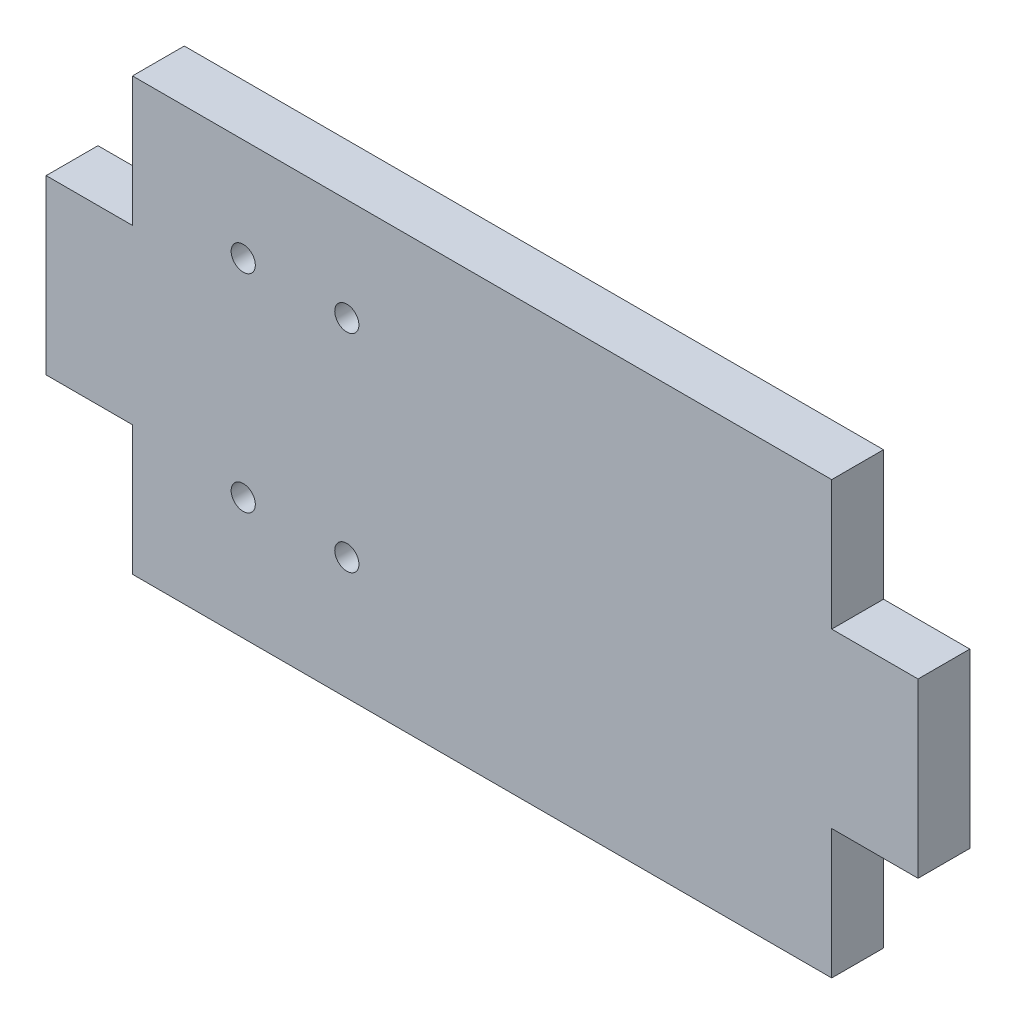
ISO-10303-21;
HEADER;
FILE_DESCRIPTION(('STEP AP214'),'2;1');
FILE_NAME('part.step','',(''),(''),'','','');
FILE_SCHEMA(('AUTOMOTIVE_DESIGN { 1 0 10303 214 1 1 1 1 }'));
ENDSEC;
DATA;
#1=APPLICATION_CONTEXT('core data for automotive mechanical design processes');
#2=APPLICATION_PROTOCOL_DEFINITION('international standard','automotive_design',2000,#1);
#3=PRODUCT_CONTEXT('',#1,'mechanical');
#4=PRODUCT('Part','Part','',(#3));
#5=PRODUCT_RELATED_PRODUCT_CATEGORY('part','',(#4));
#6=PRODUCT_DEFINITION_FORMATION('','',#4);
#7=PRODUCT_DEFINITION_CONTEXT('part definition',#1,'design');
#8=PRODUCT_DEFINITION('design','',#6,#7);
#9=PRODUCT_DEFINITION_SHAPE('','',#8);
#10=(LENGTH_UNIT() NAMED_UNIT(*) SI_UNIT(.MILLI.,.METRE.));
#11=(NAMED_UNIT(*) PLANE_ANGLE_UNIT() SI_UNIT($,.RADIAN.));
#12=(NAMED_UNIT(*) SI_UNIT($,.STERADIAN.) SOLID_ANGLE_UNIT());
#13=UNCERTAINTY_MEASURE_WITH_UNIT(LENGTH_MEASURE(1.E-05),#10,'distance_accuracy_value','');
#14=(GEOMETRIC_REPRESENTATION_CONTEXT(3) GLOBAL_UNCERTAINTY_ASSIGNED_CONTEXT((#13)) GLOBAL_UNIT_ASSIGNED_CONTEXT((#10,
#11,#12)) REPRESENTATION_CONTEXT('',''));
#15=CARTESIAN_POINT('',(0.,0.,0.));
#16=DIRECTION('',(0.,0.,1.));
#17=DIRECTION('',(1.,0.,0.));
#18=AXIS2_PLACEMENT_3D('',#15,#16,#17);
#19=CARTESIAN_POINT('',(12.8289276416906,14.12243627,9.95979797464431));
#20=DIRECTION('',(0.,0.,-1.));
#21=DIRECTION('',(-1.,0.,0.));
#22=AXIS2_PLACEMENT_3D('',#19,#20,#21);
#23=CYLINDRICAL_SURFACE('',#22,1.39999999999986);
#24=CARTESIAN_POINT('',(12.8289276416906,14.12243627,6.));
#25=DIRECTION('',(0.,0.,1.));
#26=DIRECTION('',(1.,0.,0.));
#27=AXIS2_PLACEMENT_3D('',#24,#25,#26);
#28=CIRCLE('',#27,1.39999999999986);
#29=CARTESIAN_POINT('',(14.2289276416904,14.12243627,6.));
#30=VERTEX_POINT('',#29);
#31=EDGE_CURVE('E167',#30,#30,#28,.F.);
#32=ORIENTED_EDGE('',*,*,#31,.F.);
#33=EDGE_LOOP('',(#32));
#34=FACE_BOUND('',#33,.T.);
#35=CARTESIAN_POINT('',(12.8289276416906,14.12243627,4.));
#36=DIRECTION('',(0.,0.,-1.));
#37=DIRECTION('',(-1.,0.,0.));
#38=AXIS2_PLACEMENT_3D('',#35,#36,#37);
#39=CIRCLE('',#38,1.39999999999986);
#40=CARTESIAN_POINT('',(11.4289276416907,14.12243627,4.));
#41=VERTEX_POINT('',#40);
#42=EDGE_CURVE('E41',#41,#41,#39,.F.);
#43=ORIENTED_EDGE('',*,*,#42,.F.);
#44=EDGE_LOOP('',(#43));
#45=FACE_BOUND('',#44,.T.);
#46=ADVANCED_FACE('F37',(#34,#45),#23,.F.);
#47=CARTESIAN_POINT('',(12.8289276416906,38.12243627,9.95979797464431));
#48=DIRECTION('',(0.,0.,-1.));
#49=DIRECTION('',(-1.,0.,0.));
#50=AXIS2_PLACEMENT_3D('',#47,#48,#49);
#51=CYLINDRICAL_SURFACE('',#50,1.39999999999987);
#52=CARTESIAN_POINT('',(12.8289276416906,38.12243627,6.));
#53=DIRECTION('',(0.,0.,1.));
#54=DIRECTION('',(1.,0.,0.));
#55=AXIS2_PLACEMENT_3D('',#52,#53,#54);
#56=CIRCLE('',#55,1.39999999999987);
#57=CARTESIAN_POINT('',(14.2289276416904,38.12243627,6.));
#58=VERTEX_POINT('',#57);
#59=EDGE_CURVE('E230',#58,#58,#56,.F.);
#60=ORIENTED_EDGE('',*,*,#59,.F.);
#61=EDGE_LOOP('',(#60));
#62=FACE_BOUND('',#61,.T.);
#63=CARTESIAN_POINT('',(12.8289276416906,38.12243627,4.));
#64=DIRECTION('',(0.,0.,-1.));
#65=DIRECTION('',(-1.,0.,0.));
#66=AXIS2_PLACEMENT_3D('',#63,#64,#65);
#67=CIRCLE('',#66,1.39999999999987);
#68=CARTESIAN_POINT('',(11.4289276416907,38.12243627,4.));
#69=VERTEX_POINT('',#68);
#70=EDGE_CURVE('E216',#69,#69,#67,.F.);
#71=ORIENTED_EDGE('',*,*,#70,.F.);
#72=EDGE_LOOP('',(#71));
#73=FACE_BOUND('',#72,.T.);
#74=ADVANCED_FACE('F272',(#62,#73),#51,.F.);
#75=CARTESIAN_POINT('',(24.8289276416906,38.12243627,9.95979797464431));
#76=DIRECTION('',(0.,0.,-1.));
#77=DIRECTION('',(-1.,0.,0.));
#78=AXIS2_PLACEMENT_3D('',#75,#76,#77);
#79=CYLINDRICAL_SURFACE('',#78,1.39999999999987);
#80=CARTESIAN_POINT('',(24.8289276416906,38.12243627,6.));
#81=DIRECTION('',(0.,0.,1.));
#82=DIRECTION('',(1.,0.,0.));
#83=AXIS2_PLACEMENT_3D('',#80,#81,#82);
#84=CIRCLE('',#83,1.39999999999987);
#85=CARTESIAN_POINT('',(26.2289276416904,38.12243627,6.));
#86=VERTEX_POINT('',#85);
#87=EDGE_CURVE('E225',#86,#86,#84,.F.);
#88=ORIENTED_EDGE('',*,*,#87,.F.);
#89=EDGE_LOOP('',(#88));
#90=FACE_BOUND('',#89,.T.);
#91=CARTESIAN_POINT('',(24.8289276416906,38.12243627,4.));
#92=DIRECTION('',(0.,0.,-1.));
#93=DIRECTION('',(-1.,0.,0.));
#94=AXIS2_PLACEMENT_3D('',#91,#92,#93);
#95=CIRCLE('',#94,1.39999999999987);
#96=CARTESIAN_POINT('',(23.4289276416907,38.12243627,4.));
#97=VERTEX_POINT('',#96);
#98=EDGE_CURVE('E213',#97,#97,#95,.F.);
#99=ORIENTED_EDGE('',*,*,#98,.F.);
#100=EDGE_LOOP('',(#99));
#101=FACE_BOUND('',#100,.T.);
#102=ADVANCED_FACE('F278',(#90,#101),#79,.F.);
#103=CARTESIAN_POINT('',(24.8289276416905,14.12243627,9.95979797464431));
#104=DIRECTION('',(0.,0.,-1.));
#105=DIRECTION('',(-1.,0.,0.));
#106=AXIS2_PLACEMENT_3D('',#103,#104,#105);
#107=CYLINDRICAL_SURFACE('',#106,1.39999999999987);
#108=CARTESIAN_POINT('',(24.8289276416905,14.12243627,6.));
#109=DIRECTION('',(0.,0.,1.));
#110=DIRECTION('',(1.,0.,0.));
#111=AXIS2_PLACEMENT_3D('',#108,#109,#110);
#112=CIRCLE('',#111,1.39999999999987);
#113=CARTESIAN_POINT('',(26.2289276416904,14.12243627,6.));
#114=VERTEX_POINT('',#113);
#115=EDGE_CURVE('E221',#114,#114,#112,.F.);
#116=ORIENTED_EDGE('',*,*,#115,.F.);
#117=EDGE_LOOP('',(#116));
#118=FACE_BOUND('',#117,.T.);
#119=CARTESIAN_POINT('',(24.8289276416905,14.12243627,4.));
#120=DIRECTION('',(0.,0.,-1.));
#121=DIRECTION('',(-1.,0.,0.));
#122=AXIS2_PLACEMENT_3D('',#119,#120,#121);
#123=CIRCLE('',#122,1.39999999999987);
#124=CARTESIAN_POINT('',(23.4289276416907,14.12243627,4.));
#125=VERTEX_POINT('',#124);
#126=EDGE_CURVE('E210',#125,#125,#123,.F.);
#127=ORIENTED_EDGE('',*,*,#126,.F.);
#128=EDGE_LOOP('',(#127));
#129=FACE_BOUND('',#128,.T.);
#130=ADVANCED_FACE('F284',(#118,#129),#107,.F.);
#131=CARTESIAN_POINT('',(0.,35.,6.));
#132=DIRECTION('',(0.,-1.,0.));
#133=DIRECTION('',(0.,0.,-1.));
#134=AXIS2_PLACEMENT_3D('',#131,#132,#133);
#135=PLANE('',#134);
#136=DIRECTION('',(-1.,0.,0.));
#137=VECTOR('',#136,1.);
#138=CARTESIAN_POINT('',(0.,35.,0.));
#139=LINE('',#138,#137);
#140=CARTESIAN_POINT('',(0.,35.,0.));
#141=VERTEX_POINT('',#140);
#142=CARTESIAN_POINT('',(-10.,35.,0.));
#143=VERTEX_POINT('',#142);
#144=EDGE_CURVE('E164',#141,#143,#139,.T.);
#145=ORIENTED_EDGE('',*,*,#144,.T.);
#146=DIRECTION('',(0.,0.,-1.));
#147=VECTOR('',#146,1.);
#148=CARTESIAN_POINT('',(-10.,35.,6.));
#149=LINE('',#148,#147);
#150=CARTESIAN_POINT('',(-10.,35.,6.));
#151=VERTEX_POINT('',#150);
#152=EDGE_CURVE('E11',#151,#143,#149,.T.);
#153=ORIENTED_EDGE('',*,*,#152,.F.);
#154=DIRECTION('',(-1.,0.,0.));
#155=VECTOR('',#154,1.);
#156=CARTESIAN_POINT('',(0.,35.,6.));
#157=LINE('',#156,#155);
#158=CARTESIAN_POINT('',(0.,35.,6.));
#159=VERTEX_POINT('',#158);
#160=EDGE_CURVE('E236',#159,#151,#157,.T.);
#161=ORIENTED_EDGE('',*,*,#160,.F.);
#162=DIRECTION('',(0.,0.,-1.));
#163=VECTOR('',#162,1.);
#164=CARTESIAN_POINT('',(0.,35.,6.));
#165=LINE('',#164,#163);
#166=EDGE_CURVE('E56',#159,#141,#165,.T.);
#167=ORIENTED_EDGE('',*,*,#166,.T.);
#168=EDGE_LOOP('',(#145,#153,#161,#167));
#169=FACE_BOUND('',#168,.T.);
#170=ADVANCED_FACE('F39',(#169),#135,.F.);
#171=CARTESIAN_POINT('',(-10.,0.,6.));
#172=DIRECTION('',(1.,0.,0.));
#173=DIRECTION('',(0.,1.,0.));
#174=AXIS2_PLACEMENT_3D('',#171,#172,#173);
#175=PLANE('',#174);
#176=DIRECTION('',(0.,-1.,0.));
#177=VECTOR('',#176,1.);
#178=CARTESIAN_POINT('',(-10.,0.,0.));
#179=LINE('',#178,#177);
#180=CARTESIAN_POINT('',(-10.,15.,0.));
#181=VERTEX_POINT('',#180);
#182=EDGE_CURVE('E166',#143,#181,#179,.T.);
#183=ORIENTED_EDGE('',*,*,#182,.T.);
#184=DIRECTION('',(0.,0.,-1.));
#185=VECTOR('',#184,1.);
#186=CARTESIAN_POINT('',(-10.,15.,6.));
#187=LINE('',#186,#185);
#188=CARTESIAN_POINT('',(-10.,15.,6.));
#189=VERTEX_POINT('',#188);
#190=EDGE_CURVE('E47',#189,#181,#187,.T.);
#191=ORIENTED_EDGE('',*,*,#190,.F.);
#192=DIRECTION('',(0.,-1.,0.));
#193=VECTOR('',#192,1.);
#194=CARTESIAN_POINT('',(-10.,0.,6.));
#195=LINE('',#194,#193);
#196=EDGE_CURVE('E106',#151,#189,#195,.T.);
#197=ORIENTED_EDGE('',*,*,#196,.F.);
#198=ORIENTED_EDGE('',*,*,#152,.T.);
#199=EDGE_LOOP('',(#183,#191,#197,#198));
#200=FACE_BOUND('',#199,.T.);
#201=ADVANCED_FACE('F376',(#200),#175,.F.);
#202=CARTESIAN_POINT('',(0.,15.,6.));
#203=DIRECTION('',(0.,-1.,0.));
#204=DIRECTION('',(0.,0.,-1.));
#205=AXIS2_PLACEMENT_3D('',#202,#203,#204);
#206=PLANE('',#205);
#207=DIRECTION('',(-1.,0.,0.));
#208=VECTOR('',#207,1.);
#209=CARTESIAN_POINT('',(0.,15.,0.));
#210=LINE('',#209,#208);
#211=CARTESIAN_POINT('',(0.,15.,0.));
#212=VERTEX_POINT('',#211);
#213=EDGE_CURVE('E170',#212,#181,#210,.T.);
#214=ORIENTED_EDGE('',*,*,#213,.F.);
#215=DIRECTION('',(0.,0.,-1.));
#216=VECTOR('',#215,1.);
#217=CARTESIAN_POINT('',(0.,15.,6.));
#218=LINE('',#217,#216);
#219=CARTESIAN_POINT('',(0.,15.,6.));
#220=VERTEX_POINT('',#219);
#221=EDGE_CURVE('E207',#220,#212,#218,.T.);
#222=ORIENTED_EDGE('',*,*,#221,.F.);
#223=DIRECTION('',(-1.,0.,0.));
#224=VECTOR('',#223,1.);
#225=CARTESIAN_POINT('',(0.,15.,6.));
#226=LINE('',#225,#224);
#227=EDGE_CURVE('E239',#220,#189,#226,.T.);
#228=ORIENTED_EDGE('',*,*,#227,.T.);
#229=ORIENTED_EDGE('',*,*,#190,.T.);
#230=EDGE_LOOP('',(#214,#222,#228,#229));
#231=FACE_BOUND('',#230,.T.);
#232=ADVANCED_FACE('F269',(#231),#206,.T.);
#233=CARTESIAN_POINT('',(0.,0.,6.));
#234=DIRECTION('',(-1.,0.,0.));
#235=DIRECTION('',(0.,0.,1.));
#236=AXIS2_PLACEMENT_3D('',#233,#234,#235);
#237=PLANE('',#236);
#238=DIRECTION('',(0.,1.,0.));
#239=VECTOR('',#238,1.);
#240=CARTESIAN_POINT('',(0.,0.,0.));
#241=LINE('',#240,#239);
#242=CARTESIAN_POINT('',(0.,0.,0.));
#243=VERTEX_POINT('',#242);
#244=EDGE_CURVE('E173',#243,#212,#241,.T.);
#245=ORIENTED_EDGE('',*,*,#244,.F.);
#246=DIRECTION('',(0.,0.,-1.));
#247=VECTOR('',#246,1.);
#248=CARTESIAN_POINT('',(0.,0.,6.));
#249=LINE('',#248,#247);
#250=CARTESIAN_POINT('',(0.,0.,6.));
#251=VERTEX_POINT('',#250);
#252=EDGE_CURVE('E205',#251,#243,#249,.T.);
#253=ORIENTED_EDGE('',*,*,#252,.F.);
#254=DIRECTION('',(0.,1.,0.));
#255=VECTOR('',#254,1.);
#256=CARTESIAN_POINT('',(0.,0.,6.));
#257=LINE('',#256,#255);
#258=EDGE_CURVE('E160',#251,#220,#257,.T.);
#259=ORIENTED_EDGE('',*,*,#258,.T.);
#260=ORIENTED_EDGE('',*,*,#221,.T.);
#261=EDGE_LOOP('',(#245,#253,#259,#260));
#262=FACE_BOUND('',#261,.T.);
#263=ADVANCED_FACE('F259',(#262),#237,.T.);
#264=CARTESIAN_POINT('',(0.,0.,6.));
#265=DIRECTION('',(0.,1.,0.));
#266=DIRECTION('',(0.,0.,1.));
#267=AXIS2_PLACEMENT_3D('',#264,#265,#266);
#268=PLANE('',#267);
#269=DIRECTION('',(1.,0.,0.));
#270=VECTOR('',#269,1.);
#271=CARTESIAN_POINT('',(0.,0.,0.));
#272=LINE('',#271,#270);
#273=CARTESIAN_POINT('',(81.,0.,0.));
#274=VERTEX_POINT('',#273);
#275=EDGE_CURVE('E176',#243,#274,#272,.T.);
#276=ORIENTED_EDGE('',*,*,#275,.T.);
#277=DIRECTION('',(0.,0.,-1.));
#278=VECTOR('',#277,1.);
#279=CARTESIAN_POINT('',(81.,0.,6.));
#280=LINE('',#279,#278);
#281=CARTESIAN_POINT('',(81.,0.,6.));
#282=VERTEX_POINT('',#281);
#283=EDGE_CURVE('E202',#282,#274,#280,.T.);
#284=ORIENTED_EDGE('',*,*,#283,.F.);
#285=DIRECTION('',(1.,0.,0.));
#286=VECTOR('',#285,1.);
#287=CARTESIAN_POINT('',(0.,0.,6.));
#288=LINE('',#287,#286);
#289=EDGE_CURVE('E243',#251,#282,#288,.T.);
#290=ORIENTED_EDGE('',*,*,#289,.F.);
#291=ORIENTED_EDGE('',*,*,#252,.T.);
#292=EDGE_LOOP('',(#276,#284,#290,#291));
#293=FACE_BOUND('',#292,.T.);
#294=ADVANCED_FACE('F268',(#293),#268,.F.);
#295=CARTESIAN_POINT('',(81.,0.,6.));
#296=DIRECTION('',(-1.,0.,0.));
#297=DIRECTION('',(0.,0.,1.));
#298=AXIS2_PLACEMENT_3D('',#295,#296,#297);
#299=PLANE('',#298);
#300=DIRECTION('',(0.,1.,0.));
#301=VECTOR('',#300,1.);
#302=CARTESIAN_POINT('',(81.,0.,0.));
#303=LINE('',#302,#301);
#304=CARTESIAN_POINT('',(81.,15.,0.));
#305=VERTEX_POINT('',#304);
#306=EDGE_CURVE('E179',#274,#305,#303,.T.);
#307=ORIENTED_EDGE('',*,*,#306,.T.);
#308=DIRECTION('',(0.,0.,-1.));
#309=VECTOR('',#308,1.);
#310=CARTESIAN_POINT('',(81.,15.,6.));
#311=LINE('',#310,#309);
#312=CARTESIAN_POINT('',(81.,15.,6.));
#313=VERTEX_POINT('',#312);
#314=EDGE_CURVE('E199',#313,#305,#311,.T.);
#315=ORIENTED_EDGE('',*,*,#314,.F.);
#316=DIRECTION('',(0.,1.,0.));
#317=VECTOR('',#316,1.);
#318=CARTESIAN_POINT('',(81.,0.,6.));
#319=LINE('',#318,#317);
#320=EDGE_CURVE('E146',#282,#313,#319,.T.);
#321=ORIENTED_EDGE('',*,*,#320,.F.);
#322=ORIENTED_EDGE('',*,*,#283,.T.);
#323=EDGE_LOOP('',(#307,#315,#321,#322));
#324=FACE_BOUND('',#323,.T.);
#325=ADVANCED_FACE('F398',(#324),#299,.F.);
#326=CARTESIAN_POINT('',(0.,15.,6.));
#327=DIRECTION('',(0.,1.,0.));
#328=DIRECTION('',(0.,0.,1.));
#329=AXIS2_PLACEMENT_3D('',#326,#327,#328);
#330=PLANE('',#329);
#331=DIRECTION('',(1.,0.,0.));
#332=VECTOR('',#331,1.);
#333=CARTESIAN_POINT('',(0.,15.,0.));
#334=LINE('',#333,#332);
#335=CARTESIAN_POINT('',(91.,15.,0.));
#336=VERTEX_POINT('',#335);
#337=EDGE_CURVE('E181',#305,#336,#334,.T.);
#338=ORIENTED_EDGE('',*,*,#337,.T.);
#339=DIRECTION('',(0.,0.,-1.));
#340=VECTOR('',#339,1.);
#341=CARTESIAN_POINT('',(91.,15.,6.));
#342=LINE('',#341,#340);
#343=CARTESIAN_POINT('',(91.,15.,6.));
#344=VERTEX_POINT('',#343);
#345=EDGE_CURVE('E197',#344,#336,#342,.T.);
#346=ORIENTED_EDGE('',*,*,#345,.F.);
#347=DIRECTION('',(1.,0.,0.));
#348=VECTOR('',#347,1.);
#349=CARTESIAN_POINT('',(0.,15.,6.));
#350=LINE('',#349,#348);
#351=EDGE_CURVE('E245',#313,#344,#350,.T.);
#352=ORIENTED_EDGE('',*,*,#351,.F.);
#353=ORIENTED_EDGE('',*,*,#314,.T.);
#354=EDGE_LOOP('',(#338,#346,#352,#353));
#355=FACE_BOUND('',#354,.T.);
#356=ADVANCED_FACE('F402',(#355),#330,.F.);
#357=CARTESIAN_POINT('',(91.,0.,6.));
#358=DIRECTION('',(1.,0.,0.));
#359=DIRECTION('',(0.,0.,-1.));
#360=AXIS2_PLACEMENT_3D('',#357,#358,#359);
#361=PLANE('',#360);
#362=DIRECTION('',(0.,-1.,0.));
#363=VECTOR('',#362,1.);
#364=CARTESIAN_POINT('',(91.,0.,0.));
#365=LINE('',#364,#363);
#366=CARTESIAN_POINT('',(91.,35.,0.));
#367=VERTEX_POINT('',#366);
#368=EDGE_CURVE('E184',#367,#336,#365,.T.);
#369=ORIENTED_EDGE('',*,*,#368,.F.);
#370=DIRECTION('',(0.,0.,-1.));
#371=VECTOR('',#370,1.);
#372=CARTESIAN_POINT('',(91.,35.,6.));
#373=LINE('',#372,#371);
#374=CARTESIAN_POINT('',(91.,35.,6.));
#375=VERTEX_POINT('',#374);
#376=EDGE_CURVE('E195',#375,#367,#373,.T.);
#377=ORIENTED_EDGE('',*,*,#376,.F.);
#378=DIRECTION('',(0.,-1.,0.));
#379=VECTOR('',#378,1.);
#380=CARTESIAN_POINT('',(91.,0.,6.));
#381=LINE('',#380,#379);
#382=EDGE_CURVE('E246',#375,#344,#381,.T.);
#383=ORIENTED_EDGE('',*,*,#382,.T.);
#384=ORIENTED_EDGE('',*,*,#345,.T.);
#385=EDGE_LOOP('',(#369,#377,#383,#384));
#386=FACE_BOUND('',#385,.T.);
#387=ADVANCED_FACE('F403',(#386),#361,.T.);
#388=CARTESIAN_POINT('',(0.,35.,6.));
#389=DIRECTION('',(0.,1.,0.));
#390=DIRECTION('',(0.,0.,1.));
#391=AXIS2_PLACEMENT_3D('',#388,#389,#390);
#392=PLANE('',#391);
#393=DIRECTION('',(1.,0.,0.));
#394=VECTOR('',#393,1.);
#395=CARTESIAN_POINT('',(0.,35.,0.));
#396=LINE('',#395,#394);
#397=CARTESIAN_POINT('',(81.,35.,0.));
#398=VERTEX_POINT('',#397);
#399=EDGE_CURVE('E187',#398,#367,#396,.T.);
#400=ORIENTED_EDGE('',*,*,#399,.F.);
#401=DIRECTION('',(0.,0.,-1.));
#402=VECTOR('',#401,1.);
#403=CARTESIAN_POINT('',(81.,35.,6.));
#404=LINE('',#403,#402);
#405=CARTESIAN_POINT('',(81.,35.,6.));
#406=VERTEX_POINT('',#405);
#407=EDGE_CURVE('E154',#406,#398,#404,.T.);
#408=ORIENTED_EDGE('',*,*,#407,.F.);
#409=DIRECTION('',(1.,0.,0.));
#410=VECTOR('',#409,1.);
#411=CARTESIAN_POINT('',(0.,35.,6.));
#412=LINE('',#411,#410);
#413=EDGE_CURVE('E143',#406,#375,#412,.T.);
#414=ORIENTED_EDGE('',*,*,#413,.T.);
#415=ORIENTED_EDGE('',*,*,#376,.T.);
#416=EDGE_LOOP('',(#400,#408,#414,#415));
#417=FACE_BOUND('',#416,.T.);
#418=ADVANCED_FACE('F251',(#417),#392,.T.);
#419=CARTESIAN_POINT('',(81.,50.,0.));
#420=VERTEX_POINT('',#419);
#421=EDGE_CURVE('E151',#398,#420,#303,.T.);
#422=ORIENTED_EDGE('',*,*,#421,.T.);
#423=DIRECTION('',(0.,0.,-1.));
#424=VECTOR('',#423,1.);
#425=CARTESIAN_POINT('',(81.,50.,6.));
#426=LINE('',#425,#424);
#427=CARTESIAN_POINT('',(81.,50.,6.));
#428=VERTEX_POINT('',#427);
#429=EDGE_CURVE('E148',#428,#420,#426,.T.);
#430=ORIENTED_EDGE('',*,*,#429,.F.);
#431=EDGE_CURVE('E135',#406,#428,#319,.T.);
#432=ORIENTED_EDGE('',*,*,#431,.F.);
#433=ORIENTED_EDGE('',*,*,#407,.T.);
#434=EDGE_LOOP('',(#422,#430,#432,#433));
#435=FACE_BOUND('',#434,.T.);
#436=ADVANCED_FACE('F149',(#435),#299,.F.);
#437=CARTESIAN_POINT('',(0.,50.,6.));
#438=DIRECTION('',(0.,1.,0.));
#439=DIRECTION('',(0.,0.,1.));
#440=AXIS2_PLACEMENT_3D('',#437,#438,#439);
#441=PLANE('',#440);
#442=DIRECTION('',(1.,0.,0.));
#443=VECTOR('',#442,1.);
#444=CARTESIAN_POINT('',(0.,50.,0.));
#445=LINE('',#444,#443);
#446=CARTESIAN_POINT('',(0.,50.,0.));
#447=VERTEX_POINT('',#446);
#448=EDGE_CURVE('E190',#447,#420,#445,.T.);
#449=ORIENTED_EDGE('',*,*,#448,.F.);
#450=DIRECTION('',(0.,0.,-1.));
#451=VECTOR('',#450,1.);
#452=CARTESIAN_POINT('',(0.,50.,6.));
#453=LINE('',#452,#451);
#454=CARTESIAN_POINT('',(0.,50.,6.));
#455=VERTEX_POINT('',#454);
#456=EDGE_CURVE('E94',#455,#447,#453,.T.);
#457=ORIENTED_EDGE('',*,*,#456,.F.);
#458=DIRECTION('',(1.,0.,0.));
#459=VECTOR('',#458,1.);
#460=CARTESIAN_POINT('',(0.,50.,6.));
#461=LINE('',#460,#459);
#462=EDGE_CURVE('E140',#455,#428,#461,.T.);
#463=ORIENTED_EDGE('',*,*,#462,.T.);
#464=ORIENTED_EDGE('',*,*,#429,.T.);
#465=EDGE_LOOP('',(#449,#457,#463,#464));
#466=FACE_BOUND('',#465,.T.);
#467=ADVANCED_FACE('F156',(#466),#441,.T.);
#468=EDGE_CURVE('E177',#141,#447,#241,.T.);
#469=ORIENTED_EDGE('',*,*,#468,.F.);
#470=ORIENTED_EDGE('',*,*,#166,.F.);
#471=EDGE_CURVE('E157',#159,#455,#257,.T.);
#472=ORIENTED_EDGE('',*,*,#471,.T.);
#473=ORIENTED_EDGE('',*,*,#456,.T.);
#474=EDGE_LOOP('',(#469,#470,#472,#473));
#475=FACE_BOUND('',#474,.T.);
#476=ADVANCED_FACE('F256',(#475),#237,.T.);
#477=CARTESIAN_POINT('',(0.,0.,6.));
#478=DIRECTION('',(0.,0.,1.));
#479=DIRECTION('',(1.,0.,0.));
#480=AXIS2_PLACEMENT_3D('',#477,#478,#479);
#481=PLANE('',#480);
#482=ORIENTED_EDGE('',*,*,#115,.T.);
#483=EDGE_LOOP('',(#482));
#484=FACE_BOUND('',#483,.T.);
#485=ORIENTED_EDGE('',*,*,#87,.T.);
#486=EDGE_LOOP('',(#485));
#487=FACE_BOUND('',#486,.T.);
#488=ORIENTED_EDGE('',*,*,#59,.T.);
#489=EDGE_LOOP('',(#488));
#490=FACE_BOUND('',#489,.T.);
#491=ORIENTED_EDGE('',*,*,#31,.T.);
#492=EDGE_LOOP('',(#491));
#493=FACE_BOUND('',#492,.T.);
#494=ORIENTED_EDGE('',*,*,#160,.T.);
#495=ORIENTED_EDGE('',*,*,#196,.T.);
#496=ORIENTED_EDGE('',*,*,#227,.F.);
#497=ORIENTED_EDGE('',*,*,#258,.F.);
#498=ORIENTED_EDGE('',*,*,#289,.T.);
#499=ORIENTED_EDGE('',*,*,#320,.T.);
#500=ORIENTED_EDGE('',*,*,#351,.T.);
#501=ORIENTED_EDGE('',*,*,#382,.F.);
#502=ORIENTED_EDGE('',*,*,#413,.F.);
#503=ORIENTED_EDGE('',*,*,#431,.T.);
#504=ORIENTED_EDGE('',*,*,#462,.F.);
#505=ORIENTED_EDGE('',*,*,#471,.F.);
#506=EDGE_LOOP('',(#494,#495,#496,#497,#498,#499,#500,#501,#502,#503,#504,#505));
#507=FACE_BOUND('',#506,.T.);
#508=ADVANCED_FACE('F137',(#484,#487,#490,#493,#507),#481,.T.);
#509=CARTESIAN_POINT('',(0.,0.,0.));
#510=DIRECTION('',(0.,0.,1.));
#511=DIRECTION('',(1.,0.,0.));
#512=AXIS2_PLACEMENT_3D('',#509,#510,#511);
#513=PLANE('',#512);
#514=CARTESIAN_POINT('',(24.8289276416905,14.12243627,0.));
#515=DIRECTION('',(0.,0.,-1.));
#516=DIRECTION('',(-1.,0.,0.));
#517=AXIS2_PLACEMENT_3D('',#514,#515,#516);
#518=CIRCLE('',#517,2.99999999999988);
#519=CARTESIAN_POINT('',(21.8289276416907,14.12243627,0.));
#520=VERTEX_POINT('',#519);
#521=EDGE_CURVE('E298',#520,#520,#518,.T.);
#522=ORIENTED_EDGE('',*,*,#521,.F.);
#523=EDGE_LOOP('',(#522));
#524=FACE_BOUND('',#523,.T.);
#525=CARTESIAN_POINT('',(12.8289276416906,14.12243627,0.));
#526=DIRECTION('',(0.,0.,-1.));
#527=DIRECTION('',(-1.,0.,0.));
#528=AXIS2_PLACEMENT_3D('',#525,#526,#527);
#529=CIRCLE('',#528,2.99999999999987);
#530=CARTESIAN_POINT('',(9.82892764169068,14.12243627,0.));
#531=VERTEX_POINT('',#530);
#532=EDGE_CURVE('E302',#531,#531,#529,.T.);
#533=ORIENTED_EDGE('',*,*,#532,.F.);
#534=EDGE_LOOP('',(#533));
#535=FACE_BOUND('',#534,.T.);
#536=CARTESIAN_POINT('',(12.8289276416906,38.12243627,0.));
#537=DIRECTION('',(0.,0.,-1.));
#538=DIRECTION('',(-1.,0.,0.));
#539=AXIS2_PLACEMENT_3D('',#536,#537,#538);
#540=CIRCLE('',#539,2.99999999999987);
#541=CARTESIAN_POINT('',(9.82892764169068,38.12243627,0.));
#542=VERTEX_POINT('',#541);
#543=EDGE_CURVE('E306',#542,#542,#540,.T.);
#544=ORIENTED_EDGE('',*,*,#543,.F.);
#545=EDGE_LOOP('',(#544));
#546=FACE_BOUND('',#545,.T.);
#547=CARTESIAN_POINT('',(24.8289276416906,38.12243627,0.));
#548=DIRECTION('',(0.,0.,-1.));
#549=DIRECTION('',(-1.,0.,0.));
#550=AXIS2_PLACEMENT_3D('',#547,#548,#549);
#551=CIRCLE('',#550,2.99999999999988);
#552=CARTESIAN_POINT('',(21.8289276416907,38.12243627,0.));
#553=VERTEX_POINT('',#552);
#554=EDGE_CURVE('E309',#553,#553,#551,.T.);
#555=ORIENTED_EDGE('',*,*,#554,.F.);
#556=EDGE_LOOP('',(#555));
#557=FACE_BOUND('',#556,.T.);
#558=ORIENTED_EDGE('',*,*,#144,.F.);
#559=ORIENTED_EDGE('',*,*,#468,.T.);
#560=ORIENTED_EDGE('',*,*,#448,.T.);
#561=ORIENTED_EDGE('',*,*,#421,.F.);
#562=ORIENTED_EDGE('',*,*,#399,.T.);
#563=ORIENTED_EDGE('',*,*,#368,.T.);
#564=ORIENTED_EDGE('',*,*,#337,.F.);
#565=ORIENTED_EDGE('',*,*,#306,.F.);
#566=ORIENTED_EDGE('',*,*,#275,.F.);
#567=ORIENTED_EDGE('',*,*,#244,.T.);
#568=ORIENTED_EDGE('',*,*,#213,.T.);
#569=ORIENTED_EDGE('',*,*,#182,.F.);
#570=EDGE_LOOP('',(#558,#559,#560,#561,#562,#563,#564,#565,#566,#567,#568,#569));
#571=FACE_BOUND('',#570,.T.);
#572=ADVANCED_FACE('F254',(#524,#535,#546,#557,#571),#513,.F.);
#573=CARTESIAN_POINT('',(24.8289276416905,14.12243627,4.));
#574=DIRECTION('',(0.,0.,-1.));
#575=DIRECTION('',(-1.,0.,0.));
#576=AXIS2_PLACEMENT_3D('',#573,#574,#575);
#577=PLANE('',#576);
#578=CARTESIAN_POINT('',(24.8289276416905,14.12243627,4.));
#579=DIRECTION('',(0.,0.,-1.));
#580=DIRECTION('',(-1.,0.,0.));
#581=AXIS2_PLACEMENT_3D('',#578,#579,#580);
#582=CIRCLE('',#581,2.99999999999988);
#583=CARTESIAN_POINT('',(21.8289276416907,14.12243627,4.));
#584=VERTEX_POINT('',#583);
#585=EDGE_CURVE('E324',#584,#584,#582,.T.);
#586=ORIENTED_EDGE('',*,*,#585,.T.);
#587=EDGE_LOOP('',(#586));
#588=FACE_BOUND('',#587,.T.);
#589=ORIENTED_EDGE('',*,*,#126,.T.);
#590=EDGE_LOOP('',(#589));
#591=FACE_BOUND('',#590,.T.);
#592=ADVANCED_FACE('F287',(#588,#591),#577,.T.);
#593=CARTESIAN_POINT('',(24.8289276416905,14.12243627,4.));
#594=DIRECTION('',(0.,0.,-1.));
#595=DIRECTION('',(-1.,0.,0.));
#596=AXIS2_PLACEMENT_3D('',#593,#594,#595);
#597=CYLINDRICAL_SURFACE('',#596,2.99999999999988);
#598=ORIENTED_EDGE('',*,*,#585,.F.);
#599=EDGE_LOOP('',(#598));
#600=FACE_BOUND('',#599,.T.);
#601=ORIENTED_EDGE('',*,*,#521,.T.);
#602=EDGE_LOOP('',(#601));
#603=FACE_BOUND('',#602,.T.);
#604=ADVANCED_FACE('F292',(#600,#603),#597,.F.);
#605=CARTESIAN_POINT('',(24.8289276416906,38.12243627,4.));
#606=DIRECTION('',(0.,0.,-1.));
#607=DIRECTION('',(-1.,0.,0.));
#608=AXIS2_PLACEMENT_3D('',#605,#606,#607);
#609=PLANE('',#608);
#610=CARTESIAN_POINT('',(24.8289276416906,38.12243627,4.));
#611=DIRECTION('',(0.,0.,-1.));
#612=DIRECTION('',(-1.,0.,0.));
#613=AXIS2_PLACEMENT_3D('',#610,#611,#612);
#614=CIRCLE('',#613,2.99999999999988);
#615=CARTESIAN_POINT('',(21.8289276416907,38.12243627,4.));
#616=VERTEX_POINT('',#615);
#617=EDGE_CURVE('E214',#616,#616,#614,.T.);
#618=ORIENTED_EDGE('',*,*,#617,.T.);
#619=EDGE_LOOP('',(#618));
#620=FACE_BOUND('',#619,.T.);
#621=ORIENTED_EDGE('',*,*,#98,.T.);
#622=EDGE_LOOP('',(#621));
#623=FACE_BOUND('',#622,.T.);
#624=ADVANCED_FACE('F355',(#620,#623),#609,.T.);
#625=CARTESIAN_POINT('',(24.8289276416906,38.12243627,4.));
#626=DIRECTION('',(0.,0.,-1.));
#627=DIRECTION('',(-1.,0.,0.));
#628=AXIS2_PLACEMENT_3D('',#625,#626,#627);
#629=CYLINDRICAL_SURFACE('',#628,2.99999999999988);
#630=ORIENTED_EDGE('',*,*,#617,.F.);
#631=EDGE_LOOP('',(#630));
#632=FACE_BOUND('',#631,.T.);
#633=ORIENTED_EDGE('',*,*,#554,.T.);
#634=EDGE_LOOP('',(#633));
#635=FACE_BOUND('',#634,.T.);
#636=ADVANCED_FACE('F345',(#632,#635),#629,.F.);
#637=CARTESIAN_POINT('',(12.8289276416906,38.12243627,4.));
#638=DIRECTION('',(0.,0.,-1.));
#639=DIRECTION('',(-1.,0.,0.));
#640=AXIS2_PLACEMENT_3D('',#637,#638,#639);
#641=PLANE('',#640);
#642=CARTESIAN_POINT('',(12.8289276416906,38.12243627,4.));
#643=DIRECTION('',(0.,0.,-1.));
#644=DIRECTION('',(-1.,0.,0.));
#645=AXIS2_PLACEMENT_3D('',#642,#643,#644);
#646=CIRCLE('',#645,2.99999999999987);
#647=CARTESIAN_POINT('',(9.82892764169068,38.12243627,4.));
#648=VERTEX_POINT('',#647);
#649=EDGE_CURVE('E311',#648,#648,#646,.T.);
#650=ORIENTED_EDGE('',*,*,#649,.T.);
#651=EDGE_LOOP('',(#650));
#652=FACE_BOUND('',#651,.T.);
#653=ORIENTED_EDGE('',*,*,#70,.T.);
#654=EDGE_LOOP('',(#653));
#655=FACE_BOUND('',#654,.T.);
#656=ADVANCED_FACE('F335',(#652,#655),#641,.T.);
#657=CARTESIAN_POINT('',(12.8289276416906,38.12243627,4.));
#658=DIRECTION('',(0.,0.,-1.));
#659=DIRECTION('',(-1.,0.,0.));
#660=AXIS2_PLACEMENT_3D('',#657,#658,#659);
#661=CYLINDRICAL_SURFACE('',#660,2.99999999999987);
#662=ORIENTED_EDGE('',*,*,#649,.F.);
#663=EDGE_LOOP('',(#662));
#664=FACE_BOUND('',#663,.T.);
#665=ORIENTED_EDGE('',*,*,#543,.T.);
#666=EDGE_LOOP('',(#665));
#667=FACE_BOUND('',#666,.T.);
#668=ADVANCED_FACE('F332',(#664,#667),#661,.F.);
#669=CARTESIAN_POINT('',(12.8289276416906,14.12243627,4.));
#670=DIRECTION('',(0.,0.,-1.));
#671=DIRECTION('',(-1.,0.,0.));
#672=AXIS2_PLACEMENT_3D('',#669,#670,#671);
#673=PLANE('',#672);
#674=CARTESIAN_POINT('',(12.8289276416906,14.12243627,4.));
#675=DIRECTION('',(0.,0.,-1.));
#676=DIRECTION('',(-1.,0.,0.));
#677=AXIS2_PLACEMENT_3D('',#674,#675,#676);
#678=CIRCLE('',#677,2.99999999999987);
#679=CARTESIAN_POINT('',(9.82892764169068,14.12243627,4.));
#680=VERTEX_POINT('',#679);
#681=EDGE_CURVE('E328',#680,#680,#678,.T.);
#682=ORIENTED_EDGE('',*,*,#681,.T.);
#683=EDGE_LOOP('',(#682));
#684=FACE_BOUND('',#683,.T.);
#685=ORIENTED_EDGE('',*,*,#42,.T.);
#686=EDGE_LOOP('',(#685));
#687=FACE_BOUND('',#686,.T.);
#688=ADVANCED_FACE('F334',(#684,#687),#673,.T.);
#689=CARTESIAN_POINT('',(12.8289276416906,14.12243627,4.));
#690=DIRECTION('',(0.,0.,-1.));
#691=DIRECTION('',(-1.,0.,0.));
#692=AXIS2_PLACEMENT_3D('',#689,#690,#691);
#693=CYLINDRICAL_SURFACE('',#692,2.99999999999987);
#694=ORIENTED_EDGE('',*,*,#681,.F.);
#695=EDGE_LOOP('',(#694));
#696=FACE_BOUND('',#695,.T.);
#697=ORIENTED_EDGE('',*,*,#532,.T.);
#698=EDGE_LOOP('',(#697));
#699=FACE_BOUND('',#698,.T.);
#700=ADVANCED_FACE('F342',(#696,#699),#693,.F.);
#701=CLOSED_SHELL('',(#46,#74,#102,#130,#170,#201,#232,#263,#294,#325,#356,#387,#418,#436,#467,
#476,#508,#572,#592,#604,#624,#636,#656,#668,#688,#700));
#702=MANIFOLD_SOLID_BREP('B2',#701);
#703=ADVANCED_BREP_SHAPE_REPRESENTATION('',(#18,#702),#14);
#704=SHAPE_DEFINITION_REPRESENTATION(#9,#703);
ENDSEC;
END-ISO-10303-21;
